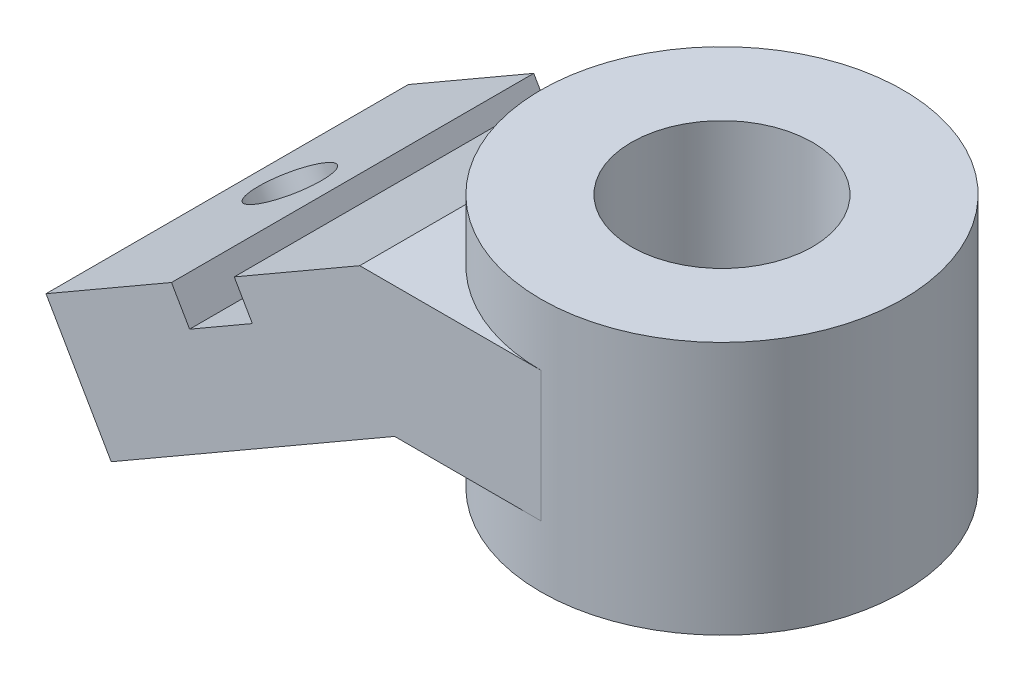
ISO-10303-21;
HEADER;
FILE_DESCRIPTION(('STEP AP214'),'2;1');
FILE_NAME('part.step','',(''),(''),'','','');
FILE_SCHEMA(('AUTOMOTIVE_DESIGN { 1 0 10303 214 1 1 1 1 }'));
ENDSEC;
DATA;
#1=APPLICATION_CONTEXT('core data for automotive mechanical design processes');
#2=APPLICATION_PROTOCOL_DEFINITION('international standard','automotive_design',2000,#1);
#3=PRODUCT_CONTEXT('',#1,'mechanical');
#4=PRODUCT('Part','Part','',(#3));
#5=PRODUCT_RELATED_PRODUCT_CATEGORY('part','',(#4));
#6=PRODUCT_DEFINITION_FORMATION('','',#4);
#7=PRODUCT_DEFINITION_CONTEXT('part definition',#1,'design');
#8=PRODUCT_DEFINITION('design','',#6,#7);
#9=PRODUCT_DEFINITION_SHAPE('','',#8);
#10=(LENGTH_UNIT() NAMED_UNIT(*) SI_UNIT(.MILLI.,.METRE.));
#11=(NAMED_UNIT(*) PLANE_ANGLE_UNIT() SI_UNIT($,.RADIAN.));
#12=(NAMED_UNIT(*) SI_UNIT($,.STERADIAN.) SOLID_ANGLE_UNIT());
#13=UNCERTAINTY_MEASURE_WITH_UNIT(LENGTH_MEASURE(1.E-05),#10,'distance_accuracy_value','');
#14=(GEOMETRIC_REPRESENTATION_CONTEXT(3) GLOBAL_UNCERTAINTY_ASSIGNED_CONTEXT((#13)) GLOBAL_UNIT_ASSIGNED_CONTEXT((#10,
#11,#12)) REPRESENTATION_CONTEXT('',''));
#15=CARTESIAN_POINT('',(0.,0.,0.));
#16=DIRECTION('',(0.,0.,1.));
#17=DIRECTION('',(1.,0.,0.));
#18=AXIS2_PLACEMENT_3D('',#15,#16,#17);
#19=CARTESIAN_POINT('',(-68.3012701892219,-16.0000000000001,50.));
#20=DIRECTION('',(0.500000000000001,-0.866025403784438,0.));
#21=DIRECTION('',(0.866025403784438,0.500000000000001,0.));
#22=AXIS2_PLACEMENT_3D('',#19,#20,#21);
#23=PLANE('',#22);
#24=CARTESIAN_POINT('',(-59.6410161513775,-11.0000000000001,25.));
#25=DIRECTION('',(-0.500000000000002,0.866025403784438,0.));
#26=DIRECTION('',(-0.866025403784438,-0.500000000000002,0.));
#27=AXIS2_PLACEMENT_3D('',#24,#25,#26);
#28=CIRCLE('',#27,5.00000000000002);
#29=CARTESIAN_POINT('',(-63.9711431702997,-13.5000000000001,25.));
#30=VERTEX_POINT('',#29);
#31=EDGE_CURVE('E173',#30,#30,#28,.T.);
#32=ORIENTED_EDGE('',*,*,#31,.F.);
#33=EDGE_LOOP('',(#32));
#34=FACE_BOUND('',#33,.T.);
#35=DIRECTION('',(-0.866025403784438,-0.500000000000001,0.));
#36=VECTOR('',#35,1.);
#37=CARTESIAN_POINT('',(-68.3012701892219,-16.0000000000001,50.));
#38=LINE('',#37,#36);
#39=CARTESIAN_POINT('',(-50.9807621135332,-6.00000000000001,50.));
#40=VERTEX_POINT('',#39);
#41=CARTESIAN_POINT('',(-68.3012701892219,-16.0000000000001,50.));
#42=VERTEX_POINT('',#41);
#43=EDGE_CURVE('E220',#40,#42,#38,.T.);
#44=ORIENTED_EDGE('',*,*,#43,.F.);
#45=DIRECTION('',(0.,0.,1.));
#46=VECTOR('',#45,1.);
#47=CARTESIAN_POINT('',(-50.9807621135332,-6.00000000000001,0.));
#48=LINE('',#47,#46);
#49=CARTESIAN_POINT('',(-50.9807621135332,-6.00000000000001,0.));
#50=VERTEX_POINT('',#49);
#51=EDGE_CURVE('E170',#50,#40,#48,.T.);
#52=ORIENTED_EDGE('',*,*,#51,.F.);
#53=DIRECTION('',(-0.866025403784438,-0.500000000000001,0.));
#54=VECTOR('',#53,1.);
#55=CARTESIAN_POINT('',(-68.3012701892219,-16.0000000000001,0.));
#56=LINE('',#55,#54);
#57=CARTESIAN_POINT('',(-68.3012701892219,-16.0000000000001,0.));
#58=VERTEX_POINT('',#57);
#59=EDGE_CURVE('E156',#50,#58,#56,.T.);
#60=ORIENTED_EDGE('',*,*,#59,.T.);
#61=DIRECTION('',(0.,0.,-1.));
#62=VECTOR('',#61,1.);
#63=CARTESIAN_POINT('',(-68.3012701892219,-16.0000000000001,50.));
#64=LINE('',#63,#62);
#65=EDGE_CURVE('E268',#42,#58,#64,.T.);
#66=ORIENTED_EDGE('',*,*,#65,.F.);
#67=EDGE_LOOP('',(#44,#52,#60,#66));
#68=FACE_BOUND('',#67,.T.);
#69=ADVANCED_FACE('F45',(#34,#68),#23,.F.);
#70=CARTESIAN_POINT('',(-25.,9.,50.));
#71=DIRECTION('',(0.,-1.,0.));
#72=DIRECTION('',(0.,0.,-1.));
#73=AXIS2_PLACEMENT_3D('',#70,#71,#72);
#74=PLANE('',#73);
#75=CARTESIAN_POINT('',(0.,9.,25.));
#76=DIRECTION('',(0.,-1.,0.));
#77=DIRECTION('',(0.,0.,-1.));
#78=AXIS2_PLACEMENT_3D('',#75,#76,#77);
#79=CIRCLE('',#78,25.);
#80=CARTESIAN_POINT('',(0.,9.,0.));
#81=VERTEX_POINT('',#80);
#82=CARTESIAN_POINT('',(-25.,8.99999999999998,25.));
#83=VERTEX_POINT('',#82);
#84=EDGE_CURVE('E212',#81,#83,#79,.F.);
#85=ORIENTED_EDGE('',*,*,#84,.F.);
#86=DIRECTION('',(-1.,0.,0.));
#87=VECTOR('',#86,1.);
#88=CARTESIAN_POINT('',(-25.,9.,0.));
#89=LINE('',#88,#87);
#90=CARTESIAN_POINT('',(-25.,9.,0.));
#91=VERTEX_POINT('',#90);
#92=EDGE_CURVE('E240',#81,#91,#89,.T.);
#93=ORIENTED_EDGE('',*,*,#92,.T.);
#94=DIRECTION('',(0.,0.,-1.));
#95=VECTOR('',#94,1.);
#96=CARTESIAN_POINT('',(-25.,9.,50.));
#97=LINE('',#96,#95);
#98=EDGE_CURVE('E54',#83,#91,#97,.T.);
#99=ORIENTED_EDGE('',*,*,#98,.F.);
#100=EDGE_LOOP('',(#85,#93,#99));
#101=FACE_BOUND('',#100,.T.);
#102=ADVANCED_FACE('F281',(#101),#74,.F.);
#103=CARTESIAN_POINT('',(0.,-9.,50.));
#104=DIRECTION('',(0.,1.,0.));
#105=DIRECTION('',(-1.,0.,0.));
#106=AXIS2_PLACEMENT_3D('',#103,#104,#105);
#107=PLANE('',#106);
#108=CARTESIAN_POINT('',(0.,-9.,25.));
#109=DIRECTION('',(0.,1.,0.));
#110=DIRECTION('',(-1.,0.,0.));
#111=AXIS2_PLACEMENT_3D('',#108,#109,#110);
#112=CIRCLE('',#111,25.);
#113=CARTESIAN_POINT('',(-20.1769145362398,-9.,10.2388306764919));
#114=VERTEX_POINT('',#113);
#115=CARTESIAN_POINT('',(0.,-9.,0.));
#116=VERTEX_POINT('',#115);
#117=EDGE_CURVE('E200',#114,#116,#112,.F.);
#118=ORIENTED_EDGE('',*,*,#117,.F.);
#119=DIRECTION('',(0.,0.,-1.));
#120=VECTOR('',#119,1.);
#121=CARTESIAN_POINT('',(-20.1769145362398,-9.,50.));
#122=LINE('',#121,#120);
#123=CARTESIAN_POINT('',(-20.1769145362398,-9.,0.));
#124=VERTEX_POINT('',#123);
#125=EDGE_CURVE('E239',#114,#124,#122,.T.);
#126=ORIENTED_EDGE('',*,*,#125,.T.);
#127=DIRECTION('',(1.,0.,0.));
#128=VECTOR('',#127,1.);
#129=CARTESIAN_POINT('',(0.,-9.,0.));
#130=LINE('',#129,#128);
#131=EDGE_CURVE('E255',#124,#116,#130,.T.);
#132=ORIENTED_EDGE('',*,*,#131,.T.);
#133=EDGE_LOOP('',(#118,#126,#132));
#134=FACE_BOUND('',#133,.T.);
#135=ADVANCED_FACE('F289',(#134),#107,.F.);
#136=CARTESIAN_POINT('',(0.,9.,50.));
#137=VERTEX_POINT('',#136);
#138=EDGE_CURVE('E69',#83,#137,#79,.F.);
#139=ORIENTED_EDGE('',*,*,#138,.F.);
#140=CARTESIAN_POINT('',(-25.,9.,50.));
#141=VERTEX_POINT('',#140);
#142=EDGE_CURVE('E11',#141,#83,#97,.T.);
#143=ORIENTED_EDGE('',*,*,#142,.F.);
#144=DIRECTION('',(-1.,0.,0.));
#145=VECTOR('',#144,1.);
#146=CARTESIAN_POINT('',(-25.,9.,50.));
#147=LINE('',#146,#145);
#148=EDGE_CURVE('E216',#137,#141,#147,.T.);
#149=ORIENTED_EDGE('',*,*,#148,.F.);
#150=EDGE_LOOP('',(#139,#143,#149));
#151=FACE_BOUND('',#150,.T.);
#152=ADVANCED_FACE('F47',(#151),#74,.F.);
#153=CARTESIAN_POINT('',(-42.3205080756888,-1.,0.));
#154=VERTEX_POINT('',#153);
#155=EDGE_CURVE('E244',#91,#154,#56,.T.);
#156=ORIENTED_EDGE('',*,*,#155,.T.);
#157=DIRECTION('',(0.,0.,1.));
#158=VECTOR('',#157,1.);
#159=CARTESIAN_POINT('',(-42.3205080756888,-1.,0.));
#160=LINE('',#159,#158);
#161=CARTESIAN_POINT('',(-42.3205080756888,-1.,50.));
#162=VERTEX_POINT('',#161);
#163=EDGE_CURVE('E174',#154,#162,#160,.T.);
#164=ORIENTED_EDGE('',*,*,#163,.T.);
#165=EDGE_CURVE('E222',#141,#162,#38,.T.);
#166=ORIENTED_EDGE('',*,*,#165,.F.);
#167=ORIENTED_EDGE('',*,*,#142,.T.);
#168=ORIENTED_EDGE('',*,*,#98,.T.);
#169=EDGE_LOOP('',(#156,#164,#166,#167,#168));
#170=FACE_BOUND('',#169,.T.);
#171=ADVANCED_FACE('F277',(#170),#23,.F.);
#172=CARTESIAN_POINT('',(-59.3012701892219,-31.58845726812,50.));
#173=DIRECTION('',(0.866025403784438,0.500000000000002,0.));
#174=DIRECTION('',(-0.500000000000002,0.866025403784438,0.));
#175=AXIS2_PLACEMENT_3D('',#172,#173,#174);
#176=PLANE('',#175);
#177=DIRECTION('',(0.500000000000002,-0.866025403784438,0.));
#178=VECTOR('',#177,1.);
#179=CARTESIAN_POINT('',(-59.3012701892219,-31.58845726812,0.));
#180=LINE('',#179,#178);
#181=CARTESIAN_POINT('',(-59.3012701892219,-31.58845726812,0.));
#182=VERTEX_POINT('',#181);
#183=EDGE_CURVE('E248',#58,#182,#180,.T.);
#184=ORIENTED_EDGE('',*,*,#183,.T.);
#185=DIRECTION('',(0.,0.,-1.));
#186=VECTOR('',#185,1.);
#187=CARTESIAN_POINT('',(-59.3012701892219,-31.58845726812,50.));
#188=LINE('',#187,#186);
#189=CARTESIAN_POINT('',(-59.3012701892219,-31.58845726812,50.));
#190=VERTEX_POINT('',#189);
#191=EDGE_CURVE('E265',#190,#182,#188,.T.);
#192=ORIENTED_EDGE('',*,*,#191,.F.);
#193=DIRECTION('',(0.500000000000002,-0.866025403784438,0.));
#194=VECTOR('',#193,1.);
#195=CARTESIAN_POINT('',(-59.3012701892219,-31.58845726812,50.));
#196=LINE('',#195,#194);
#197=EDGE_CURVE('E226',#42,#190,#196,.T.);
#198=ORIENTED_EDGE('',*,*,#197,.F.);
#199=ORIENTED_EDGE('',*,*,#65,.T.);
#200=EDGE_LOOP('',(#184,#192,#198,#199));
#201=FACE_BOUND('',#200,.T.);
#202=ADVANCED_FACE('F297',(#201),#176,.F.);
#203=CARTESIAN_POINT('',(-20.1769145362398,-9.,50.));
#204=DIRECTION('',(-0.500000000000001,0.866025403784438,0.));
#205=DIRECTION('',(-0.866025403784438,-0.500000000000001,0.));
#206=AXIS2_PLACEMENT_3D('',#203,#204,#205);
#207=PLANE('',#206);
#208=CARTESIAN_POINT('',(-50.6410161513775,-26.5884572681199,25.));
#209=DIRECTION('',(-0.500000000000001,0.866025403784438,0.));
#210=DIRECTION('',(-0.866025403784438,-0.500000000000001,0.));
#211=AXIS2_PLACEMENT_3D('',#208,#209,#210);
#212=CIRCLE('',#211,5.00000000000001);
#213=CARTESIAN_POINT('',(-54.9711431702997,-29.08845726812,25.));
#214=VERTEX_POINT('',#213);
#215=EDGE_CURVE('E183',#214,#214,#212,.T.);
#216=ORIENTED_EDGE('',*,*,#215,.T.);
#217=EDGE_LOOP('',(#216));
#218=FACE_BOUND('',#217,.T.);
#219=CARTESIAN_POINT('',(0.,2.64914703891415,25.));
#220=DIRECTION('',(-0.500000000000001,0.866025403784438,0.));
#221=DIRECTION('',(-0.866025403784438,-0.500000000000001,0.));
#222=AXIS2_PLACEMENT_3D('',#219,#220,#221);
#223=ELLIPSE('',#222,28.8675134594813,25.);
#224=CARTESIAN_POINT('',(-20.1769145362398,-9.,39.7611693235081));
#225=VERTEX_POINT('',#224);
#226=EDGE_CURVE('E207',#225,#114,#223,.F.);
#227=ORIENTED_EDGE('',*,*,#226,.F.);
#228=CARTESIAN_POINT('',(-20.1769145362398,-9.,50.));
#229=VERTEX_POINT('',#228);
#230=EDGE_CURVE('E261',#229,#225,#122,.T.);
#231=ORIENTED_EDGE('',*,*,#230,.F.);
#232=DIRECTION('',(0.866025403784438,0.500000000000001,0.));
#233=VECTOR('',#232,1.);
#234=CARTESIAN_POINT('',(-20.1769145362398,-9.,50.));
#235=LINE('',#234,#233);
#236=EDGE_CURVE('E229',#190,#229,#235,.T.);
#237=ORIENTED_EDGE('',*,*,#236,.F.);
#238=ORIENTED_EDGE('',*,*,#191,.T.);
#239=DIRECTION('',(0.866025403784438,0.500000000000001,0.));
#240=VECTOR('',#239,1.);
#241=CARTESIAN_POINT('',(-20.1769145362398,-9.,0.));
#242=LINE('',#241,#240);
#243=EDGE_CURVE('E251',#182,#124,#242,.T.);
#244=ORIENTED_EDGE('',*,*,#243,.T.);
#245=ORIENTED_EDGE('',*,*,#125,.F.);
#246=EDGE_LOOP('',(#227,#231,#237,#238,#244,#245));
#247=FACE_BOUND('',#246,.T.);
#248=ADVANCED_FACE('F293',(#218,#247),#207,.F.);
#249=CARTESIAN_POINT('',(0.,-9.,50.));
#250=VERTEX_POINT('',#249);
#251=EDGE_CURVE('E208',#250,#225,#112,.F.);
#252=ORIENTED_EDGE('',*,*,#251,.F.);
#253=DIRECTION('',(1.,0.,0.));
#254=VECTOR('',#253,1.);
#255=CARTESIAN_POINT('',(0.,-9.,50.));
#256=LINE('',#255,#254);
#257=EDGE_CURVE('E232',#229,#250,#256,.T.);
#258=ORIENTED_EDGE('',*,*,#257,.F.);
#259=ORIENTED_EDGE('',*,*,#230,.T.);
#260=EDGE_LOOP('',(#252,#258,#259));
#261=FACE_BOUND('',#260,.T.);
#262=ADVANCED_FACE('F309',(#261),#107,.F.);
#263=CARTESIAN_POINT('',(0.,0.,50.));
#264=DIRECTION('',(0.,0.,-1.));
#265=DIRECTION('',(-1.,0.,0.));
#266=AXIS2_PLACEMENT_3D('',#263,#264,#265);
#267=PLANE('',#266);
#268=DIRECTION('',(0.86602540378444,0.499999999999998,0.));
#269=VECTOR('',#268,1.);
#270=CARTESIAN_POINT('',(-48.4807621135332,-10.3301270189222,50.));
#271=LINE('',#270,#269);
#272=CARTESIAN_POINT('',(-48.4807621135332,-10.3301270189222,50.));
#273=VERTEX_POINT('',#272);
#274=CARTESIAN_POINT('',(-39.8205080756888,-5.3301270189222,50.));
#275=VERTEX_POINT('',#274);
#276=EDGE_CURVE('E161',#273,#275,#271,.T.);
#277=ORIENTED_EDGE('',*,*,#276,.F.);
#278=DIRECTION('',(0.500000000000001,-0.866025403784438,0.));
#279=VECTOR('',#278,1.);
#280=CARTESIAN_POINT('',(-50.9807621135332,-6.00000000000001,50.));
#281=LINE('',#280,#279);
#282=EDGE_CURVE('E140',#40,#273,#281,.T.);
#283=ORIENTED_EDGE('',*,*,#282,.F.);
#284=ORIENTED_EDGE('',*,*,#43,.T.);
#285=ORIENTED_EDGE('',*,*,#197,.T.);
#286=ORIENTED_EDGE('',*,*,#236,.T.);
#287=ORIENTED_EDGE('',*,*,#257,.T.);
#288=DIRECTION('',(0.,1.,0.));
#289=VECTOR('',#288,1.);
#290=CARTESIAN_POINT('',(0.,9.,50.));
#291=LINE('',#290,#289);
#292=EDGE_CURVE('E236',#250,#137,#291,.T.);
#293=ORIENTED_EDGE('',*,*,#292,.T.);
#294=ORIENTED_EDGE('',*,*,#148,.T.);
#295=ORIENTED_EDGE('',*,*,#165,.T.);
#296=DIRECTION('',(-0.499999999999997,0.86602540378444,0.));
#297=VECTOR('',#296,1.);
#298=CARTESIAN_POINT('',(-42.3205080756888,-1.,50.));
#299=LINE('',#298,#297);
#300=EDGE_CURVE('E158',#275,#162,#299,.T.);
#301=ORIENTED_EDGE('',*,*,#300,.F.);
#302=EDGE_LOOP('',(#277,#283,#284,#285,#286,#287,#293,#294,#295,#301));
#303=FACE_BOUND('',#302,.T.);
#304=ADVANCED_FACE('F299',(#303),#267,.F.);
#305=CARTESIAN_POINT('',(0.,0.,0.));
#306=DIRECTION('',(0.,0.,-1.));
#307=DIRECTION('',(-1.,0.,0.));
#308=AXIS2_PLACEMENT_3D('',#305,#306,#307);
#309=PLANE('',#308);
#310=DIRECTION('',(0.500000000000001,-0.866025403784438,0.));
#311=VECTOR('',#310,1.);
#312=CARTESIAN_POINT('',(-50.9807621135332,-6.00000000000001,0.));
#313=LINE('',#312,#311);
#314=CARTESIAN_POINT('',(-48.4807621135332,-10.3301270189222,0.));
#315=VERTEX_POINT('',#314);
#316=EDGE_CURVE('E137',#50,#315,#313,.T.);
#317=ORIENTED_EDGE('',*,*,#316,.T.);
#318=DIRECTION('',(0.86602540378444,0.499999999999998,0.));
#319=VECTOR('',#318,1.);
#320=CARTESIAN_POINT('',(-48.4807621135332,-10.3301270189222,0.));
#321=LINE('',#320,#319);
#322=CARTESIAN_POINT('',(-39.8205080756888,-5.3301270189222,0.));
#323=VERTEX_POINT('',#322);
#324=EDGE_CURVE('E148',#315,#323,#321,.T.);
#325=ORIENTED_EDGE('',*,*,#324,.T.);
#326=DIRECTION('',(-0.499999999999997,0.86602540378444,0.));
#327=VECTOR('',#326,1.);
#328=CARTESIAN_POINT('',(-42.3205080756888,-1.,0.));
#329=LINE('',#328,#327);
#330=EDGE_CURVE('E61',#323,#154,#329,.T.);
#331=ORIENTED_EDGE('',*,*,#330,.T.);
#332=ORIENTED_EDGE('',*,*,#155,.F.);
#333=ORIENTED_EDGE('',*,*,#92,.F.);
#334=DIRECTION('',(0.,1.,0.));
#335=VECTOR('',#334,1.);
#336=CARTESIAN_POINT('',(0.,9.,0.));
#337=LINE('',#336,#335);
#338=EDGE_CURVE('E221',#116,#81,#337,.T.);
#339=ORIENTED_EDGE('',*,*,#338,.F.);
#340=ORIENTED_EDGE('',*,*,#131,.F.);
#341=ORIENTED_EDGE('',*,*,#243,.F.);
#342=ORIENTED_EDGE('',*,*,#183,.F.);
#343=ORIENTED_EDGE('',*,*,#59,.F.);
#344=EDGE_LOOP('',(#317,#325,#331,#332,#333,#339,#340,#341,#342,#343));
#345=FACE_BOUND('',#344,.T.);
#346=ADVANCED_FACE('F154',(#345),#309,.T.);
#347=CARTESIAN_POINT('',(0.,17.5,25.));
#348=DIRECTION('',(0.,-1.,0.));
#349=DIRECTION('',(0.,0.,-1.));
#350=AXIS2_PLACEMENT_3D('',#347,#348,#349);
#351=CYLINDRICAL_SURFACE('',#350,25.);
#352=ORIENTED_EDGE('',*,*,#292,.F.);
#353=ORIENTED_EDGE('',*,*,#251,.T.);
#354=ORIENTED_EDGE('',*,*,#226,.T.);
#355=ORIENTED_EDGE('',*,*,#117,.T.);
#356=ORIENTED_EDGE('',*,*,#338,.T.);
#357=ORIENTED_EDGE('',*,*,#84,.T.);
#358=ORIENTED_EDGE('',*,*,#138,.T.);
#359=EDGE_LOOP('',(#352,#353,#354,#355,#356,#357,#358));
#360=FACE_BOUND('',#359,.T.);
#361=CARTESIAN_POINT('',(0.,17.5,25.));
#362=DIRECTION('',(0.,1.,0.));
#363=DIRECTION('',(0.,0.,1.));
#364=AXIS2_PLACEMENT_3D('',#361,#362,#363);
#365=CIRCLE('',#364,25.);
#366=CARTESIAN_POINT('',(0.,17.5,50.));
#367=VERTEX_POINT('',#366);
#368=EDGE_CURVE('E196',#367,#367,#365,.T.);
#369=ORIENTED_EDGE('',*,*,#368,.F.);
#370=EDGE_LOOP('',(#369));
#371=FACE_BOUND('',#370,.T.);
#372=CARTESIAN_POINT('',(0.,-17.5,25.));
#373=DIRECTION('',(0.,1.,0.));
#374=DIRECTION('',(0.,0.,1.));
#375=AXIS2_PLACEMENT_3D('',#372,#373,#374);
#376=CIRCLE('',#375,25.);
#377=CARTESIAN_POINT('',(0.,-17.5,50.));
#378=VERTEX_POINT('',#377);
#379=EDGE_CURVE('E195',#378,#378,#376,.T.);
#380=ORIENTED_EDGE('',*,*,#379,.T.);
#381=EDGE_LOOP('',(#380));
#382=FACE_BOUND('',#381,.T.);
#383=ADVANCED_FACE('F284',(#360,#371,#382),#351,.T.);
#384=CARTESIAN_POINT('',(0.,17.5,25.));
#385=DIRECTION('',(0.,1.,0.));
#386=DIRECTION('',(0.,0.,1.));
#387=AXIS2_PLACEMENT_3D('',#384,#385,#386);
#388=PLANE('',#387);
#389=CARTESIAN_POINT('',(0.,17.5,25.));
#390=DIRECTION('',(0.,1.,0.));
#391=DIRECTION('',(0.,0.,1.));
#392=AXIS2_PLACEMENT_3D('',#389,#390,#391);
#393=CIRCLE('',#392,12.5);
#394=CARTESIAN_POINT('',(0.,17.5,37.5));
#395=VERTEX_POINT('',#394);
#396=EDGE_CURVE('E187',#395,#395,#393,.T.);
#397=ORIENTED_EDGE('',*,*,#396,.F.);
#398=EDGE_LOOP('',(#397));
#399=FACE_BOUND('',#398,.T.);
#400=ORIENTED_EDGE('',*,*,#368,.T.);
#401=EDGE_LOOP('',(#400));
#402=FACE_BOUND('',#401,.T.);
#403=ADVANCED_FACE('F336',(#399,#402),#388,.T.);
#404=CARTESIAN_POINT('',(0.,-17.5,25.));
#405=DIRECTION('',(0.,1.,0.));
#406=DIRECTION('',(0.,0.,1.));
#407=AXIS2_PLACEMENT_3D('',#404,#405,#406);
#408=PLANE('',#407);
#409=CARTESIAN_POINT('',(0.,-17.5,25.));
#410=DIRECTION('',(0.,1.,0.));
#411=DIRECTION('',(0.,0.,1.));
#412=AXIS2_PLACEMENT_3D('',#409,#410,#411);
#413=CIRCLE('',#412,12.5);
#414=CARTESIAN_POINT('',(0.,-17.5,37.5));
#415=VERTEX_POINT('',#414);
#416=EDGE_CURVE('E191',#415,#415,#413,.T.);
#417=ORIENTED_EDGE('',*,*,#416,.T.);
#418=EDGE_LOOP('',(#417));
#419=FACE_BOUND('',#418,.T.);
#420=ORIENTED_EDGE('',*,*,#379,.F.);
#421=EDGE_LOOP('',(#420));
#422=FACE_BOUND('',#421,.T.);
#423=ADVANCED_FACE('F337',(#419,#422),#408,.F.);
#424=CARTESIAN_POINT('',(0.,17.5,25.));
#425=DIRECTION('',(0.,1.,0.));
#426=DIRECTION('',(0.,0.,1.));
#427=AXIS2_PLACEMENT_3D('',#424,#425,#426);
#428=CYLINDRICAL_SURFACE('',#427,12.5);
#429=ORIENTED_EDGE('',*,*,#416,.F.);
#430=EDGE_LOOP('',(#429));
#431=FACE_BOUND('',#430,.T.);
#432=ORIENTED_EDGE('',*,*,#396,.T.);
#433=EDGE_LOOP('',(#432));
#434=FACE_BOUND('',#433,.T.);
#435=ADVANCED_FACE('F340',(#431,#434),#428,.F.);
#436=CARTESIAN_POINT('',(-59.6410161513775,-11.0000000000001,25.));
#437=DIRECTION('',(-0.500000000000002,0.866025403784438,0.));
#438=DIRECTION('',(-0.866025403784438,-0.500000000000002,0.));
#439=AXIS2_PLACEMENT_3D('',#436,#437,#438);
#440=CYLINDRICAL_SURFACE('',#439,5.00000000000001);
#441=ORIENTED_EDGE('',*,*,#215,.F.);
#442=EDGE_LOOP('',(#441));
#443=FACE_BOUND('',#442,.T.);
#444=ORIENTED_EDGE('',*,*,#31,.T.);
#445=EDGE_LOOP('',(#444));
#446=FACE_BOUND('',#445,.T.);
#447=ADVANCED_FACE('F347',(#443,#446),#440,.F.);
#448=CARTESIAN_POINT('',(-50.9807621135332,-6.00000000000001,0.));
#449=DIRECTION('',(-0.866025403784438,-0.500000000000001,0.));
#450=DIRECTION('',(0.500000000000001,-0.866025403784438,0.));
#451=AXIS2_PLACEMENT_3D('',#448,#449,#450);
#452=PLANE('',#451);
#453=ORIENTED_EDGE('',*,*,#282,.T.);
#454=DIRECTION('',(0.,0.,1.));
#455=VECTOR('',#454,1.);
#456=CARTESIAN_POINT('',(-48.4807621135332,-10.3301270189222,0.));
#457=LINE('',#456,#455);
#458=EDGE_CURVE('E133',#315,#273,#457,.T.);
#459=ORIENTED_EDGE('',*,*,#458,.F.);
#460=ORIENTED_EDGE('',*,*,#316,.F.);
#461=ORIENTED_EDGE('',*,*,#51,.T.);
#462=EDGE_LOOP('',(#453,#459,#460,#461));
#463=FACE_BOUND('',#462,.T.);
#464=ADVANCED_FACE('F135',(#463),#452,.F.);
#465=CARTESIAN_POINT('',(-42.3205080756888,-1.,0.));
#466=DIRECTION('',(0.86602540378444,0.499999999999997,0.));
#467=DIRECTION('',(-0.499999999999997,0.86602540378444,0.));
#468=AXIS2_PLACEMENT_3D('',#465,#466,#467);
#469=PLANE('',#468);
#470=ORIENTED_EDGE('',*,*,#300,.T.);
#471=ORIENTED_EDGE('',*,*,#163,.F.);
#472=ORIENTED_EDGE('',*,*,#330,.F.);
#473=DIRECTION('',(0.,0.,1.));
#474=VECTOR('',#473,1.);
#475=CARTESIAN_POINT('',(-39.8205080756888,-5.3301270189222,0.));
#476=LINE('',#475,#474);
#477=EDGE_CURVE('E145',#323,#275,#476,.T.);
#478=ORIENTED_EDGE('',*,*,#477,.T.);
#479=EDGE_LOOP('',(#470,#471,#472,#478));
#480=FACE_BOUND('',#479,.T.);
#481=ADVANCED_FACE('F353',(#480),#469,.F.);
#482=CARTESIAN_POINT('',(-48.4807621135332,-10.3301270189222,0.));
#483=DIRECTION('',(0.499999999999998,-0.86602540378444,0.));
#484=DIRECTION('',(0.86602540378444,0.499999999999998,0.));
#485=AXIS2_PLACEMENT_3D('',#482,#483,#484);
#486=PLANE('',#485);
#487=ORIENTED_EDGE('',*,*,#276,.T.);
#488=ORIENTED_EDGE('',*,*,#477,.F.);
#489=ORIENTED_EDGE('',*,*,#324,.F.);
#490=ORIENTED_EDGE('',*,*,#458,.T.);
#491=EDGE_LOOP('',(#487,#488,#489,#490));
#492=FACE_BOUND('',#491,.T.);
#493=ADVANCED_FACE('F149',(#492),#486,.F.);
#494=CLOSED_SHELL('',(#69,#102,#135,#152,#171,#202,#248,#262,#304,#346,#383,#403,#423,#435,#447,
#464,#481,#493));
#495=MANIFOLD_SOLID_BREP('B2',#494);
#496=ADVANCED_BREP_SHAPE_REPRESENTATION('',(#18,#495),#14);
#497=SHAPE_DEFINITION_REPRESENTATION(#9,#496);
ENDSEC;
END-ISO-10303-21;
